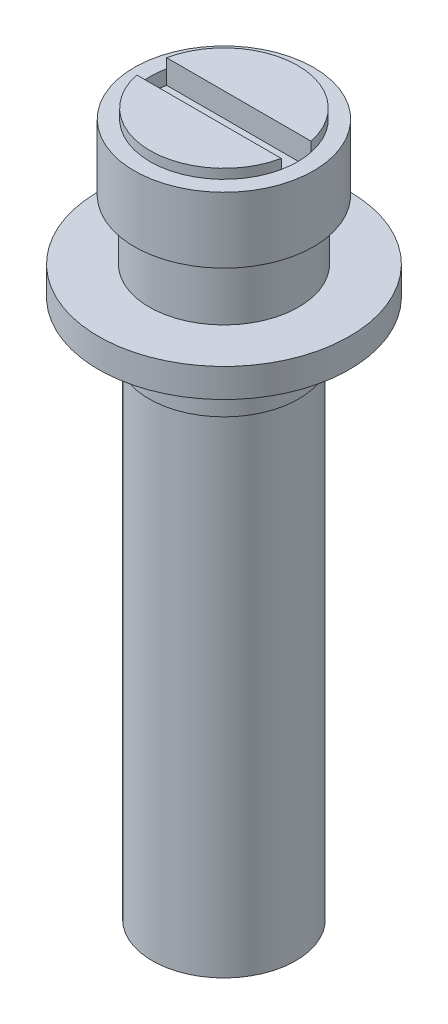
ISO-10303-21;
HEADER;
FILE_DESCRIPTION(('STEP AP214'),'2;1');
FILE_NAME('part.step','',(''),(''),'','','');
FILE_SCHEMA(('AUTOMOTIVE_DESIGN { 1 0 10303 214 1 1 1 1 }'));
ENDSEC;
DATA;
#1=APPLICATION_CONTEXT('core data for automotive mechanical design processes');
#2=APPLICATION_PROTOCOL_DEFINITION('international standard','automotive_design',2000,#1);
#3=PRODUCT_CONTEXT('',#1,'mechanical');
#4=PRODUCT('Part','Part','',(#3));
#5=PRODUCT_RELATED_PRODUCT_CATEGORY('part','',(#4));
#6=PRODUCT_DEFINITION_FORMATION('','',#4);
#7=PRODUCT_DEFINITION_CONTEXT('part definition',#1,'design');
#8=PRODUCT_DEFINITION('design','',#6,#7);
#9=PRODUCT_DEFINITION_SHAPE('','',#8);
#10=(LENGTH_UNIT() NAMED_UNIT(*) SI_UNIT(.MILLI.,.METRE.));
#11=(NAMED_UNIT(*) PLANE_ANGLE_UNIT() SI_UNIT($,.RADIAN.));
#12=(NAMED_UNIT(*) SI_UNIT($,.STERADIAN.) SOLID_ANGLE_UNIT());
#13=UNCERTAINTY_MEASURE_WITH_UNIT(LENGTH_MEASURE(1.E-05),#10,'distance_accuracy_value','');
#14=(GEOMETRIC_REPRESENTATION_CONTEXT(3) GLOBAL_UNCERTAINTY_ASSIGNED_CONTEXT((#13)) GLOBAL_UNIT_ASSIGNED_CONTEXT((#10,
#11,#12)) REPRESENTATION_CONTEXT('',''));
#15=CARTESIAN_POINT('',(0.,0.,0.));
#16=DIRECTION('',(0.,0.,1.));
#17=DIRECTION('',(1.,0.,0.));
#18=AXIS2_PLACEMENT_3D('',#15,#16,#17);
#19=CARTESIAN_POINT('',(0.,64.8939750287486,0.));
#20=DIRECTION('',(0.,1.,0.));
#21=DIRECTION('',(0.,0.,1.));
#22=AXIS2_PLACEMENT_3D('',#19,#20,#21);
#23=PLANE('',#22);
#24=DIRECTION('',(-1.,0.,0.));
#25=VECTOR('',#24,1.);
#26=CARTESIAN_POINT('',(-6.04715842359037,64.8939750287486,-1.25));
#27=LINE('',#26,#25);
#28=CARTESIAN_POINT('',(6.04715842359037,64.8939750287486,-1.25));
#29=VERTEX_POINT('',#28);
#30=CARTESIAN_POINT('',(-6.04715842359037,64.8939750287486,-1.25));
#31=VERTEX_POINT('',#30);
#32=EDGE_CURVE('E111',#29,#31,#27,.T.);
#33=ORIENTED_EDGE('',*,*,#32,.F.);
#34=CARTESIAN_POINT('',(0.,64.8939750287486,0.));
#35=DIRECTION('',(0.,-1.,0.));
#36=DIRECTION('',(0.,0.,-1.));
#37=AXIS2_PLACEMENT_3D('',#34,#35,#36);
#38=CIRCLE('',#37,6.175);
#39=EDGE_CURVE('E39',#31,#29,#38,.T.);
#40=ORIENTED_EDGE('',*,*,#39,.F.);
#41=EDGE_LOOP('',(#33,#40));
#42=FACE_BOUND('',#41,.T.);
#43=ADVANCED_FACE('F35',(#42),#23,.T.);
#44=CARTESIAN_POINT('',(0.,0.,0.));
#45=DIRECTION('',(0.,-1.,0.));
#46=DIRECTION('',(0.,0.,-1.));
#47=AXIS2_PLACEMENT_3D('',#44,#45,#46);
#48=CYLINDRICAL_SURFACE('',#47,6.175);
#49=DIRECTION('',(0.,1.,0.));
#50=VECTOR('',#49,1.);
#51=CARTESIAN_POINT('',(6.04715842359037,62.8939750287486,-1.25));
#52=LINE('',#51,#50);
#53=CARTESIAN_POINT('',(6.04715842359037,64.0939750287486,-1.25));
#54=VERTEX_POINT('',#53);
#55=EDGE_CURVE('E125',#54,#29,#52,.T.);
#56=ORIENTED_EDGE('',*,*,#55,.F.);
#57=CARTESIAN_POINT('',(0.,64.0939750287486,0.));
#58=DIRECTION('',(0.,-1.,0.));
#59=DIRECTION('',(0.,0.,-1.));
#60=AXIS2_PLACEMENT_3D('',#57,#58,#59);
#61=CIRCLE('',#60,6.175);
#62=CARTESIAN_POINT('',(-6.04715842359037,64.0939750287486,-1.25));
#63=VERTEX_POINT('',#62);
#64=EDGE_CURVE('E155',#63,#54,#61,.T.);
#65=ORIENTED_EDGE('',*,*,#64,.F.);
#66=DIRECTION('',(0.,1.,0.));
#67=VECTOR('',#66,1.);
#68=CARTESIAN_POINT('',(-6.04715842359037,62.8939750287486,-1.25));
#69=LINE('',#68,#67);
#70=EDGE_CURVE('E58',#63,#31,#69,.T.);
#71=ORIENTED_EDGE('',*,*,#70,.T.);
#72=ORIENTED_EDGE('',*,*,#39,.T.);
#73=EDGE_LOOP('',(#56,#65,#71,#72));
#74=FACE_BOUND('',#73,.T.);
#75=ADVANCED_FACE('F174',(#74),#48,.T.);
#76=DIRECTION('',(1.,0.,0.));
#77=VECTOR('',#76,1.);
#78=CARTESIAN_POINT('',(-6.04715842359037,64.8939750287486,1.25));
#79=LINE('',#78,#77);
#80=CARTESIAN_POINT('',(-6.04715842359037,64.8939750287486,1.25));
#81=VERTEX_POINT('',#80);
#82=CARTESIAN_POINT('',(6.04715842359037,64.8939750287486,1.25));
#83=VERTEX_POINT('',#82);
#84=EDGE_CURVE('E113',#81,#83,#79,.T.);
#85=ORIENTED_EDGE('',*,*,#84,.F.);
#86=EDGE_CURVE('E11',#83,#81,#38,.T.);
#87=ORIENTED_EDGE('',*,*,#86,.F.);
#88=EDGE_LOOP('',(#85,#87));
#89=FACE_BOUND('',#88,.T.);
#90=ADVANCED_FACE('F37',(#89),#23,.T.);
#91=DIRECTION('',(0.,1.,0.));
#92=VECTOR('',#91,1.);
#93=CARTESIAN_POINT('',(-6.04715842359037,62.8939750287486,1.25));
#94=LINE('',#93,#92);
#95=CARTESIAN_POINT('',(-6.04715842359037,64.0939750287486,1.25));
#96=VERTEX_POINT('',#95);
#97=EDGE_CURVE('E99',#96,#81,#94,.T.);
#98=ORIENTED_EDGE('',*,*,#97,.F.);
#99=CARTESIAN_POINT('',(6.04715842359037,64.0939750287486,1.25));
#100=VERTEX_POINT('',#99);
#101=EDGE_CURVE('E158',#100,#96,#61,.T.);
#102=ORIENTED_EDGE('',*,*,#101,.F.);
#103=DIRECTION('',(0.,1.,0.));
#104=VECTOR('',#103,1.);
#105=CARTESIAN_POINT('',(6.04715842359037,62.8939750287486,1.25));
#106=LINE('',#105,#104);
#107=EDGE_CURVE('E98',#100,#83,#106,.T.);
#108=ORIENTED_EDGE('',*,*,#107,.T.);
#109=ORIENTED_EDGE('',*,*,#86,.T.);
#110=EDGE_LOOP('',(#98,#102,#108,#109));
#111=FACE_BOUND('',#110,.T.);
#112=ADVANCED_FACE('F169',(#111),#48,.T.);
#113=CARTESIAN_POINT('',(6.175,64.0939750287486,0.));
#114=DIRECTION('',(0.,1.,0.));
#115=DIRECTION('',(0.,0.,1.));
#116=AXIS2_PLACEMENT_3D('',#113,#114,#115);
#117=PLANE('',#116);
#118=EDGE_CURVE('E156',#54,#100,#61,.T.);
#119=ORIENTED_EDGE('',*,*,#118,.T.);
#120=ORIENTED_EDGE('',*,*,#101,.T.);
#121=EDGE_CURVE('E95',#96,#63,#61,.T.);
#122=ORIENTED_EDGE('',*,*,#121,.T.);
#123=ORIENTED_EDGE('',*,*,#64,.T.);
#124=EDGE_LOOP('',(#119,#120,#122,#123));
#125=FACE_BOUND('',#124,.T.);
#126=CARTESIAN_POINT('',(0.,64.0939750287486,0.));
#127=DIRECTION('',(0.,-1.,0.));
#128=DIRECTION('',(0.,0.,-1.));
#129=AXIS2_PLACEMENT_3D('',#126,#127,#128);
#130=CIRCLE('',#129,7.5);
#131=CARTESIAN_POINT('',(0.,64.0939750287486,-7.5));
#132=VERTEX_POINT('',#131);
#133=EDGE_CURVE('E153',#132,#132,#130,.T.);
#134=ORIENTED_EDGE('',*,*,#133,.F.);
#135=EDGE_LOOP('',(#134));
#136=FACE_BOUND('',#135,.T.);
#137=ADVANCED_FACE('F164',(#125,#136),#117,.T.);
#138=CARTESIAN_POINT('',(0.,0.,0.));
#139=DIRECTION('',(0.,-1.,0.));
#140=DIRECTION('',(0.,0.,-1.));
#141=AXIS2_PLACEMENT_3D('',#138,#139,#140);
#142=CYLINDRICAL_SURFACE('',#141,7.5);
#143=ORIENTED_EDGE('',*,*,#133,.T.);
#144=EDGE_LOOP('',(#143));
#145=FACE_BOUND('',#144,.T.);
#146=CARTESIAN_POINT('',(0.,58.5939750287486,0.));
#147=DIRECTION('',(0.,-1.,0.));
#148=DIRECTION('',(0.,0.,-1.));
#149=AXIS2_PLACEMENT_3D('',#146,#147,#148);
#150=CIRCLE('',#149,7.5);
#151=CARTESIAN_POINT('',(0.,58.5939750287486,-7.5));
#152=VERTEX_POINT('',#151);
#153=EDGE_CURVE('E150',#152,#152,#150,.T.);
#154=ORIENTED_EDGE('',*,*,#153,.F.);
#155=EDGE_LOOP('',(#154));
#156=FACE_BOUND('',#155,.T.);
#157=ADVANCED_FACE('F236',(#145,#156),#142,.T.);
#158=CARTESIAN_POINT('',(7.5,58.5939750287486,0.));
#159=DIRECTION('',(0.,-1.,0.));
#160=DIRECTION('',(0.,0.,-1.));
#161=AXIS2_PLACEMENT_3D('',#158,#159,#160);
#162=PLANE('',#161);
#163=ORIENTED_EDGE('',*,*,#153,.T.);
#164=EDGE_LOOP('',(#163));
#165=FACE_BOUND('',#164,.T.);
#166=CARTESIAN_POINT('',(0.,58.5939750287486,0.));
#167=DIRECTION('',(0.,-1.,0.));
#168=DIRECTION('',(0.,0.,-1.));
#169=AXIS2_PLACEMENT_3D('',#166,#167,#168);
#170=CIRCLE('',#169,6.25);
#171=CARTESIAN_POINT('',(0.,58.5939750287486,-6.25));
#172=VERTEX_POINT('',#171);
#173=EDGE_CURVE('E147',#172,#172,#170,.T.);
#174=ORIENTED_EDGE('',*,*,#173,.F.);
#175=EDGE_LOOP('',(#174));
#176=FACE_BOUND('',#175,.T.);
#177=ADVANCED_FACE('F232',(#165,#176),#162,.T.);
#178=CARTESIAN_POINT('',(0.,0.,0.));
#179=DIRECTION('',(0.,-1.,0.));
#180=DIRECTION('',(0.,0.,-1.));
#181=AXIS2_PLACEMENT_3D('',#178,#179,#180);
#182=CYLINDRICAL_SURFACE('',#181,6.25);
#183=ORIENTED_EDGE('',*,*,#173,.T.);
#184=EDGE_LOOP('',(#183));
#185=FACE_BOUND('',#184,.T.);
#186=CARTESIAN_POINT('',(0.,53.5939750287486,0.));
#187=DIRECTION('',(0.,-1.,0.));
#188=DIRECTION('',(0.,0.,-1.));
#189=AXIS2_PLACEMENT_3D('',#186,#187,#188);
#190=CIRCLE('',#189,6.25);
#191=CARTESIAN_POINT('',(0.,53.5939750287486,-6.25));
#192=VERTEX_POINT('',#191);
#193=EDGE_CURVE('E144',#192,#192,#190,.T.);
#194=ORIENTED_EDGE('',*,*,#193,.F.);
#195=EDGE_LOOP('',(#194));
#196=FACE_BOUND('',#195,.T.);
#197=ADVANCED_FACE('F228',(#185,#196),#182,.T.);
#198=CARTESIAN_POINT('',(6.25,53.5939750287486,0.));
#199=DIRECTION('',(0.,1.,0.));
#200=DIRECTION('',(0.,0.,1.));
#201=AXIS2_PLACEMENT_3D('',#198,#199,#200);
#202=PLANE('',#201);
#203=ORIENTED_EDGE('',*,*,#193,.T.);
#204=EDGE_LOOP('',(#203));
#205=FACE_BOUND('',#204,.T.);
#206=CARTESIAN_POINT('',(0.,53.5939750287486,0.));
#207=DIRECTION('',(0.,-1.,0.));
#208=DIRECTION('',(0.,0.,-1.));
#209=AXIS2_PLACEMENT_3D('',#206,#207,#208);
#210=CIRCLE('',#209,10.5);
#211=CARTESIAN_POINT('',(0.,53.5939750287486,-10.5));
#212=VERTEX_POINT('',#211);
#213=EDGE_CURVE('E141',#212,#212,#210,.T.);
#214=ORIENTED_EDGE('',*,*,#213,.F.);
#215=EDGE_LOOP('',(#214));
#216=FACE_BOUND('',#215,.T.);
#217=ADVANCED_FACE('F224',(#205,#216),#202,.T.);
#218=CARTESIAN_POINT('',(0.,0.,0.));
#219=DIRECTION('',(0.,-1.,0.));
#220=DIRECTION('',(0.,0.,-1.));
#221=AXIS2_PLACEMENT_3D('',#218,#219,#220);
#222=CYLINDRICAL_SURFACE('',#221,10.5);
#223=ORIENTED_EDGE('',*,*,#213,.T.);
#224=EDGE_LOOP('',(#223));
#225=FACE_BOUND('',#224,.T.);
#226=CARTESIAN_POINT('',(0.,51.1939750287486,0.));
#227=DIRECTION('',(0.,-1.,0.));
#228=DIRECTION('',(0.,0.,-1.));
#229=AXIS2_PLACEMENT_3D('',#226,#227,#228);
#230=CIRCLE('',#229,10.5);
#231=CARTESIAN_POINT('',(0.,51.1939750287486,-10.5));
#232=VERTEX_POINT('',#231);
#233=EDGE_CURVE('E138',#232,#232,#230,.T.);
#234=ORIENTED_EDGE('',*,*,#233,.F.);
#235=EDGE_LOOP('',(#234));
#236=FACE_BOUND('',#235,.T.);
#237=ADVANCED_FACE('F220',(#225,#236),#222,.T.);
#238=CARTESIAN_POINT('',(10.5,51.1939750287486,0.));
#239=DIRECTION('',(0.,-1.,0.));
#240=DIRECTION('',(0.,0.,-1.));
#241=AXIS2_PLACEMENT_3D('',#238,#239,#240);
#242=PLANE('',#241);
#243=ORIENTED_EDGE('',*,*,#233,.T.);
#244=EDGE_LOOP('',(#243));
#245=FACE_BOUND('',#244,.T.);
#246=CARTESIAN_POINT('',(0.,51.1939750287486,0.));
#247=DIRECTION('',(0.,-1.,0.));
#248=DIRECTION('',(0.,0.,-1.));
#249=AXIS2_PLACEMENT_3D('',#246,#247,#248);
#250=CIRCLE('',#249,6.25);
#251=CARTESIAN_POINT('',(0.,51.1939750287486,-6.25));
#252=VERTEX_POINT('',#251);
#253=EDGE_CURVE('E135',#252,#252,#250,.T.);
#254=ORIENTED_EDGE('',*,*,#253,.F.);
#255=EDGE_LOOP('',(#254));
#256=FACE_BOUND('',#255,.T.);
#257=ADVANCED_FACE('F216',(#245,#256),#242,.T.);
#258=CARTESIAN_POINT('',(0.,0.,0.));
#259=DIRECTION('',(0.,-1.,0.));
#260=DIRECTION('',(0.,0.,-1.));
#261=AXIS2_PLACEMENT_3D('',#258,#259,#260);
#262=CYLINDRICAL_SURFACE('',#261,6.25);
#263=ORIENTED_EDGE('',*,*,#253,.T.);
#264=EDGE_LOOP('',(#263));
#265=FACE_BOUND('',#264,.T.);
#266=CARTESIAN_POINT('',(0.,46.9339750287486,0.));
#267=DIRECTION('',(0.,-1.,0.));
#268=DIRECTION('',(0.,0.,-1.));
#269=AXIS2_PLACEMENT_3D('',#266,#267,#268);
#270=CIRCLE('',#269,6.25);
#271=CARTESIAN_POINT('',(0.,46.9339750287486,-6.25));
#272=VERTEX_POINT('',#271);
#273=EDGE_CURVE('E132',#272,#272,#270,.T.);
#274=ORIENTED_EDGE('',*,*,#273,.F.);
#275=EDGE_LOOP('',(#274));
#276=FACE_BOUND('',#275,.T.);
#277=ADVANCED_FACE('F212',(#265,#276),#262,.T.);
#278=CARTESIAN_POINT('',(6.25,46.9339750287486,0.));
#279=DIRECTION('',(0.,-1.,0.));
#280=DIRECTION('',(0.,0.,-1.));
#281=AXIS2_PLACEMENT_3D('',#278,#279,#280);
#282=PLANE('',#281);
#283=ORIENTED_EDGE('',*,*,#273,.T.);
#284=EDGE_LOOP('',(#283));
#285=FACE_BOUND('',#284,.T.);
#286=CARTESIAN_POINT('',(0.,46.9339750287486,0.));
#287=DIRECTION('',(0.,-1.,0.));
#288=DIRECTION('',(0.,0.,-1.));
#289=AXIS2_PLACEMENT_3D('',#286,#287,#288);
#290=CIRCLE('',#289,6.);
#291=CARTESIAN_POINT('',(0.,46.9339750287486,-6.));
#292=VERTEX_POINT('',#291);
#293=EDGE_CURVE('E129',#292,#292,#290,.T.);
#294=ORIENTED_EDGE('',*,*,#293,.F.);
#295=EDGE_LOOP('',(#294));
#296=FACE_BOUND('',#295,.T.);
#297=ADVANCED_FACE('F208',(#285,#296),#282,.T.);
#298=CARTESIAN_POINT('',(0.,0.,0.));
#299=DIRECTION('',(0.,-1.,0.));
#300=DIRECTION('',(0.,0.,-1.));
#301=AXIS2_PLACEMENT_3D('',#298,#299,#300);
#302=CYLINDRICAL_SURFACE('',#301,6.);
#303=ORIENTED_EDGE('',*,*,#293,.T.);
#304=EDGE_LOOP('',(#303));
#305=FACE_BOUND('',#304,.T.);
#306=CARTESIAN_POINT('',(0.,6.09397502874858,0.));
#307=DIRECTION('',(0.,-1.,0.));
#308=DIRECTION('',(0.,0.,-1.));
#309=AXIS2_PLACEMENT_3D('',#306,#307,#308);
#310=CIRCLE('',#309,6.00000000000001);
#311=CARTESIAN_POINT('',(0.,6.09397502874858,-6.00000000000001));
#312=VERTEX_POINT('',#311);
#313=EDGE_CURVE('E121',#312,#312,#310,.T.);
#314=ORIENTED_EDGE('',*,*,#313,.F.);
#315=EDGE_LOOP('',(#314));
#316=FACE_BOUND('',#315,.T.);
#317=ADVANCED_FACE('F204',(#305,#316),#302,.T.);
#318=CARTESIAN_POINT('',(6.00000000000001,6.09397502874858,0.));
#319=DIRECTION('',(0.,-1.,0.));
#320=DIRECTION('',(0.,0.,-1.));
#321=AXIS2_PLACEMENT_3D('',#318,#319,#320);
#322=PLANE('',#321);
#323=ORIENTED_EDGE('',*,*,#313,.T.);
#324=EDGE_LOOP('',(#323));
#325=FACE_BOUND('',#324,.T.);
#326=ADVANCED_FACE('F201',(#325),#322,.T.);
#327=CARTESIAN_POINT('',(0.,62.8939750287486,0.));
#328=DIRECTION('',(0.,1.,0.));
#329=DIRECTION('',(0.,0.,1.));
#330=AXIS2_PLACEMENT_3D('',#327,#328,#329);
#331=CYLINDRICAL_SURFACE('',#330,6.17500000000002);
#332=ORIENTED_EDGE('',*,*,#121,.F.);
#333=CARTESIAN_POINT('',(-6.04715842359037,62.8939750287486,1.25));
#334=VERTEX_POINT('',#333);
#335=EDGE_CURVE('E88',#334,#96,#94,.T.);
#336=ORIENTED_EDGE('',*,*,#335,.F.);
#337=CARTESIAN_POINT('',(0.,62.8939750287486,0.));
#338=DIRECTION('',(0.,1.,0.));
#339=DIRECTION('',(0.,0.,1.));
#340=AXIS2_PLACEMENT_3D('',#337,#338,#339);
#341=CIRCLE('',#340,6.17500000000002);
#342=CARTESIAN_POINT('',(-6.04715842359037,62.8939750287486,-1.25));
#343=VERTEX_POINT('',#342);
#344=EDGE_CURVE('E92',#343,#334,#341,.T.);
#345=ORIENTED_EDGE('',*,*,#344,.F.);
#346=EDGE_CURVE('E119',#343,#63,#69,.T.);
#347=ORIENTED_EDGE('',*,*,#346,.T.);
#348=EDGE_LOOP('',(#332,#336,#345,#347));
#349=FACE_BOUND('',#348,.T.);
#350=ADVANCED_FACE('F90',(#349),#331,.F.);
#351=CARTESIAN_POINT('',(-6.04715842359037,62.8939750287486,-1.25));
#352=DIRECTION('',(0.,0.,-1.));
#353=DIRECTION('',(-1.,0.,0.));
#354=AXIS2_PLACEMENT_3D('',#351,#352,#353);
#355=PLANE('',#354);
#356=ORIENTED_EDGE('',*,*,#32,.T.);
#357=ORIENTED_EDGE('',*,*,#70,.F.);
#358=ORIENTED_EDGE('',*,*,#346,.F.);
#359=DIRECTION('',(-1.,0.,0.));
#360=VECTOR('',#359,1.);
#361=CARTESIAN_POINT('',(-6.04715842359037,62.8939750287486,-1.25));
#362=LINE('',#361,#360);
#363=CARTESIAN_POINT('',(6.04715842359037,62.8939750287486,-1.25));
#364=VERTEX_POINT('',#363);
#365=EDGE_CURVE('E110',#364,#343,#362,.T.);
#366=ORIENTED_EDGE('',*,*,#365,.F.);
#367=EDGE_CURVE('E122',#364,#54,#52,.T.);
#368=ORIENTED_EDGE('',*,*,#367,.T.);
#369=ORIENTED_EDGE('',*,*,#55,.T.);
#370=EDGE_LOOP('',(#356,#357,#358,#366,#368,#369));
#371=FACE_BOUND('',#370,.T.);
#372=ADVANCED_FACE('F187',(#371),#355,.F.);
#373=CARTESIAN_POINT('',(0.,62.8939750287486,0.));
#374=DIRECTION('',(0.,1.,0.));
#375=DIRECTION('',(0.,0.,1.));
#376=AXIS2_PLACEMENT_3D('',#373,#374,#375);
#377=CYLINDRICAL_SURFACE('',#376,6.17500000000007);
#378=ORIENTED_EDGE('',*,*,#118,.F.);
#379=ORIENTED_EDGE('',*,*,#367,.F.);
#380=CARTESIAN_POINT('',(0.,62.8939750287486,0.));
#381=DIRECTION('',(0.,1.,0.));
#382=DIRECTION('',(0.,0.,-1.));
#383=AXIS2_PLACEMENT_3D('',#380,#381,#382);
#384=CIRCLE('',#383,6.17500000000007);
#385=CARTESIAN_POINT('',(6.04715842359037,62.8939750287486,1.25));
#386=VERTEX_POINT('',#385);
#387=EDGE_CURVE('E106',#386,#364,#384,.T.);
#388=ORIENTED_EDGE('',*,*,#387,.F.);
#389=EDGE_CURVE('E50',#386,#100,#106,.T.);
#390=ORIENTED_EDGE('',*,*,#389,.T.);
#391=EDGE_LOOP('',(#378,#379,#388,#390));
#392=FACE_BOUND('',#391,.T.);
#393=ADVANCED_FACE('F188',(#392),#377,.F.);
#394=CARTESIAN_POINT('',(-6.04715842359037,62.8939750287486,1.25));
#395=DIRECTION('',(0.,0.,1.));
#396=DIRECTION('',(1.,0.,0.));
#397=AXIS2_PLACEMENT_3D('',#394,#395,#396);
#398=PLANE('',#397);
#399=ORIENTED_EDGE('',*,*,#84,.T.);
#400=ORIENTED_EDGE('',*,*,#107,.F.);
#401=ORIENTED_EDGE('',*,*,#389,.F.);
#402=DIRECTION('',(1.,0.,0.));
#403=VECTOR('',#402,1.);
#404=CARTESIAN_POINT('',(-6.04715842359037,62.8939750287486,1.25));
#405=LINE('',#404,#403);
#406=EDGE_CURVE('E102',#334,#386,#405,.T.);
#407=ORIENTED_EDGE('',*,*,#406,.F.);
#408=ORIENTED_EDGE('',*,*,#335,.T.);
#409=ORIENTED_EDGE('',*,*,#97,.T.);
#410=EDGE_LOOP('',(#399,#400,#401,#407,#408,#409));
#411=FACE_BOUND('',#410,.T.);
#412=ADVANCED_FACE('F103',(#411),#398,.F.);
#413=CARTESIAN_POINT('',(0.,62.8939750287486,0.));
#414=DIRECTION('',(0.,1.,0.));
#415=DIRECTION('',(0.,0.,1.));
#416=AXIS2_PLACEMENT_3D('',#413,#414,#415);
#417=PLANE('',#416);
#418=ORIENTED_EDGE('',*,*,#344,.T.);
#419=ORIENTED_EDGE('',*,*,#406,.T.);
#420=ORIENTED_EDGE('',*,*,#387,.T.);
#421=ORIENTED_EDGE('',*,*,#365,.T.);
#422=EDGE_LOOP('',(#418,#419,#420,#421));
#423=FACE_BOUND('',#422,.T.);
#424=ADVANCED_FACE('F108',(#423),#417,.T.);
#425=CLOSED_SHELL('',(#43,#75,#90,#112,#137,#157,#177,#197,#217,#237,#257,#277,#297,#317,#326,
#350,#372,#393,#412,#424));
#426=MANIFOLD_SOLID_BREP('B2',#425);
#427=ADVANCED_BREP_SHAPE_REPRESENTATION('',(#18,#426),#14);
#428=SHAPE_DEFINITION_REPRESENTATION(#9,#427);
ENDSEC;
END-ISO-10303-21;
